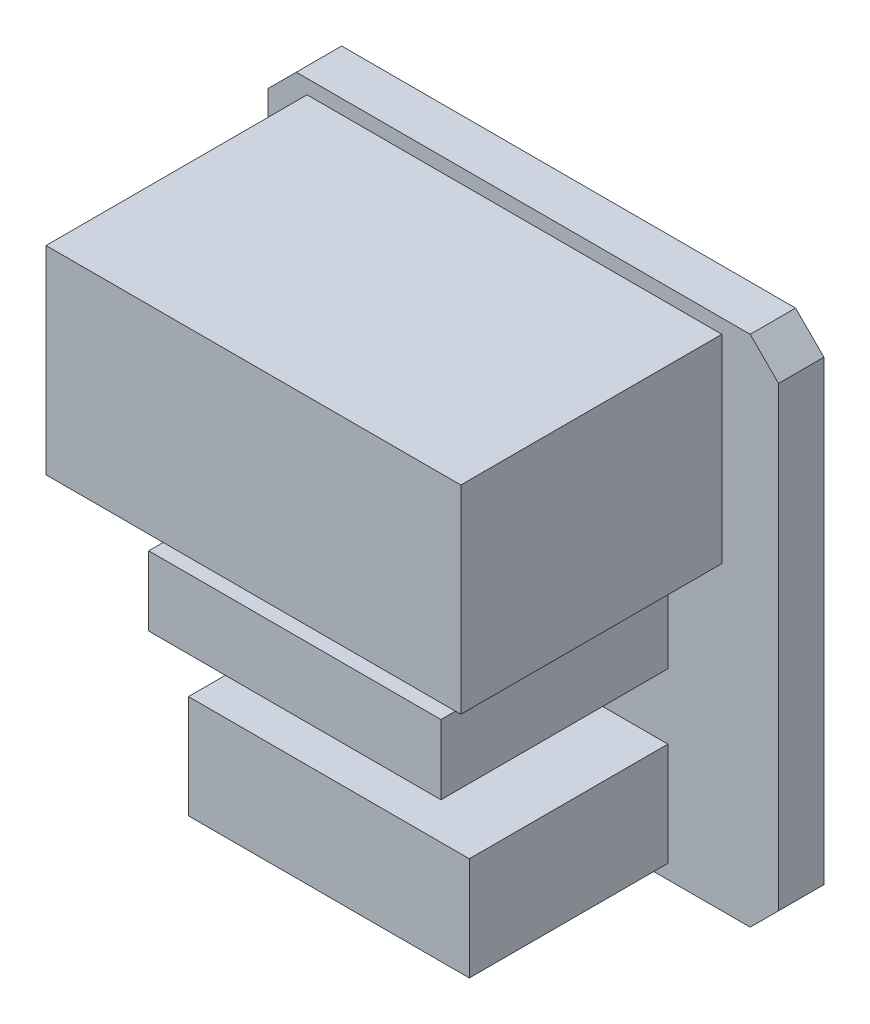
ISO-10303-21;
HEADER;
FILE_DESCRIPTION(('STEP AP214'),'2;1');
FILE_NAME('part.step','',(''),(''),'','','');
FILE_SCHEMA(('AUTOMOTIVE_DESIGN { 1 0 10303 214 1 1 1 1 }'));
ENDSEC;
DATA;
#1=APPLICATION_CONTEXT('core data for automotive mechanical design processes');
#2=APPLICATION_PROTOCOL_DEFINITION('international standard','automotive_design',2000,#1);
#3=PRODUCT_CONTEXT('',#1,'mechanical');
#4=PRODUCT('Part','Part','',(#3));
#5=PRODUCT_RELATED_PRODUCT_CATEGORY('part','',(#4));
#6=PRODUCT_DEFINITION_FORMATION('','',#4);
#7=PRODUCT_DEFINITION_CONTEXT('part definition',#1,'design');
#8=PRODUCT_DEFINITION('design','',#6,#7);
#9=PRODUCT_DEFINITION_SHAPE('','',#8);
#10=(LENGTH_UNIT() NAMED_UNIT(*) SI_UNIT(.MILLI.,.METRE.));
#11=(NAMED_UNIT(*) PLANE_ANGLE_UNIT() SI_UNIT($,.RADIAN.));
#12=(NAMED_UNIT(*) SI_UNIT($,.STERADIAN.) SOLID_ANGLE_UNIT());
#13=UNCERTAINTY_MEASURE_WITH_UNIT(LENGTH_MEASURE(1.E-05),#10,'distance_accuracy_value','');
#14=(GEOMETRIC_REPRESENTATION_CONTEXT(3) GLOBAL_UNCERTAINTY_ASSIGNED_CONTEXT((#13)) GLOBAL_UNIT_ASSIGNED_CONTEXT((#10,
#11,#12)) REPRESENTATION_CONTEXT('',''));
#15=CARTESIAN_POINT('',(0.,0.,0.));
#16=DIRECTION('',(0.,0.,1.));
#17=DIRECTION('',(1.,0.,0.));
#18=AXIS2_PLACEMENT_3D('',#15,#16,#17);
#19=CARTESIAN_POINT('',(0.,18.1,1.6));
#20=DIRECTION('',(0.,0.,-1.));
#21=DIRECTION('',(-1.,0.,0.));
#22=AXIS2_PLACEMENT_3D('',#19,#20,#21);
#23=PLANE('',#22);
#24=DIRECTION('',(0.,-1.,0.));
#25=VECTOR('',#24,1.);
#26=CARTESIAN_POINT('',(3.8,8.89,1.6));
#27=LINE('',#26,#25);
#28=CARTESIAN_POINT('',(3.8,8.89,1.6));
#29=VERTEX_POINT('',#28);
#30=CARTESIAN_POINT('',(3.8,6.44,1.6));
#31=VERTEX_POINT('',#30);
#32=EDGE_CURVE('E191',#29,#31,#27,.T.);
#33=ORIENTED_EDGE('',*,*,#32,.F.);
#34=DIRECTION('',(-1.,0.,0.));
#35=VECTOR('',#34,1.);
#36=CARTESIAN_POINT('',(3.8,8.89,1.6));
#37=LINE('',#36,#35);
#38=CARTESIAN_POINT('',(14.1,8.89,1.6));
#39=VERTEX_POINT('',#38);
#40=EDGE_CURVE('E204',#39,#29,#37,.T.);
#41=ORIENTED_EDGE('',*,*,#40,.F.);
#42=DIRECTION('',(0.,1.,0.));
#43=VECTOR('',#42,1.);
#44=CARTESIAN_POINT('',(14.1,8.89,1.6));
#45=LINE('',#44,#43);
#46=CARTESIAN_POINT('',(14.1,6.44,1.6));
#47=VERTEX_POINT('',#46);
#48=EDGE_CURVE('E213',#47,#39,#45,.T.);
#49=ORIENTED_EDGE('',*,*,#48,.F.);
#50=DIRECTION('',(1.,0.,0.));
#51=VECTOR('',#50,1.);
#52=CARTESIAN_POINT('',(3.8,6.44,1.6));
#53=LINE('',#52,#51);
#54=EDGE_CURVE('E194',#31,#47,#53,.T.);
#55=ORIENTED_EDGE('',*,*,#54,.F.);
#56=EDGE_LOOP('',(#33,#41,#49,#55));
#57=FACE_BOUND('',#56,.T.);
#58=DIRECTION('',(0.,-1.,0.));
#59=VECTOR('',#58,1.);
#60=CARTESIAN_POINT('',(0.,0.,1.6));
#61=LINE('',#60,#59);
#62=CARTESIAN_POINT('',(0.,17.1,1.6));
#63=VERTEX_POINT('',#62);
#64=CARTESIAN_POINT('',(0.,1.,1.6));
#65=VERTEX_POINT('',#64);
#66=EDGE_CURVE('E263',#63,#65,#61,.T.);
#67=ORIENTED_EDGE('',*,*,#66,.T.);
#68=DIRECTION('',(-0.707106781186546,0.707106781186549,0.));
#69=VECTOR('',#68,1.);
#70=CARTESIAN_POINT('',(1.,0.,1.6));
#71=LINE('',#70,#69);
#72=CARTESIAN_POINT('',(1.,0.,1.6));
#73=VERTEX_POINT('',#72);
#74=EDGE_CURVE('E310',#65,#73,#71,.F.);
#75=ORIENTED_EDGE('',*,*,#74,.T.);
#76=DIRECTION('',(1.,0.,0.));
#77=VECTOR('',#76,1.);
#78=CARTESIAN_POINT('',(0.,0.,1.6));
#79=LINE('',#78,#77);
#80=CARTESIAN_POINT('',(17.,0.,1.6));
#81=VERTEX_POINT('',#80);
#82=EDGE_CURVE('E266',#73,#81,#79,.T.);
#83=ORIENTED_EDGE('',*,*,#82,.T.);
#84=DIRECTION('',(-0.707106781186549,-0.707106781186546,0.));
#85=VECTOR('',#84,1.);
#86=CARTESIAN_POINT('',(18.,1.,1.6));
#87=LINE('',#86,#85);
#88=CARTESIAN_POINT('',(18.,1.,1.6));
#89=VERTEX_POINT('',#88);
#90=EDGE_CURVE('E308',#81,#89,#87,.F.);
#91=ORIENTED_EDGE('',*,*,#90,.T.);
#92=DIRECTION('',(0.,1.,0.));
#93=VECTOR('',#92,1.);
#94=CARTESIAN_POINT('',(18.,0.,1.6));
#95=LINE('',#94,#93);
#96=CARTESIAN_POINT('',(18.,17.1,1.6));
#97=VERTEX_POINT('',#96);
#98=EDGE_CURVE('E270',#89,#97,#95,.T.);
#99=ORIENTED_EDGE('',*,*,#98,.T.);
#100=DIRECTION('',(0.707106781186546,-0.707106781186549,0.));
#101=VECTOR('',#100,1.);
#102=CARTESIAN_POINT('',(17.,18.1,1.6));
#103=LINE('',#102,#101);
#104=CARTESIAN_POINT('',(17.,18.1,1.6));
#105=VERTEX_POINT('',#104);
#106=EDGE_CURVE('E306',#97,#105,#103,.F.);
#107=ORIENTED_EDGE('',*,*,#106,.T.);
#108=DIRECTION('',(-1.,0.,0.));
#109=VECTOR('',#108,1.);
#110=CARTESIAN_POINT('',(0.,18.1,1.6));
#111=LINE('',#110,#109);
#112=CARTESIAN_POINT('',(1.,18.1,1.6));
#113=VERTEX_POINT('',#112);
#114=EDGE_CURVE('E273',#105,#113,#111,.T.);
#115=ORIENTED_EDGE('',*,*,#114,.T.);
#116=DIRECTION('',(0.707106781186549,0.707106781186547,0.));
#117=VECTOR('',#116,1.);
#118=CARTESIAN_POINT('',(0.,17.1,1.6));
#119=LINE('',#118,#117);
#120=EDGE_CURVE('E304',#113,#63,#119,.F.);
#121=ORIENTED_EDGE('',*,*,#120,.T.);
#122=EDGE_LOOP('',(#67,#75,#83,#91,#99,#107,#115,#121));
#123=FACE_BOUND('',#122,.T.);
#124=DIRECTION('',(0.,-1.,0.));
#125=VECTOR('',#124,1.);
#126=CARTESIAN_POINT('',(4.2,4.14,1.6));
#127=LINE('',#126,#125);
#128=CARTESIAN_POINT('',(4.2,4.14,1.6));
#129=VERTEX_POINT('',#128);
#130=CARTESIAN_POINT('',(4.2,0.5,1.6));
#131=VERTEX_POINT('',#130);
#132=EDGE_CURVE('E229',#129,#131,#127,.T.);
#133=ORIENTED_EDGE('',*,*,#132,.F.);
#134=DIRECTION('',(-1.,0.,0.));
#135=VECTOR('',#134,1.);
#136=CARTESIAN_POINT('',(4.2,4.14,1.6));
#137=LINE('',#136,#135);
#138=CARTESIAN_POINT('',(14.1,4.14,1.6));
#139=VERTEX_POINT('',#138);
#140=EDGE_CURVE('E234',#139,#129,#137,.T.);
#141=ORIENTED_EDGE('',*,*,#140,.F.);
#142=DIRECTION('',(0.,1.,0.));
#143=VECTOR('',#142,1.);
#144=CARTESIAN_POINT('',(14.1,4.14,1.6));
#145=LINE('',#144,#143);
#146=CARTESIAN_POINT('',(14.1,0.5,1.6));
#147=VERTEX_POINT('',#146);
#148=EDGE_CURVE('E246',#147,#139,#145,.T.);
#149=ORIENTED_EDGE('',*,*,#148,.F.);
#150=DIRECTION('',(1.,0.,0.));
#151=VECTOR('',#150,1.);
#152=CARTESIAN_POINT('',(4.2,0.5,1.6));
#153=LINE('',#152,#151);
#154=EDGE_CURVE('E243',#131,#147,#153,.T.);
#155=ORIENTED_EDGE('',*,*,#154,.F.);
#156=EDGE_LOOP('',(#133,#141,#149,#155));
#157=FACE_BOUND('',#156,.T.);
#158=DIRECTION('',(0.,-1.,0.));
#159=VECTOR('',#158,1.);
#160=CARTESIAN_POINT('',(1.38,17.6,1.6));
#161=LINE('',#160,#159);
#162=CARTESIAN_POINT('',(1.38,17.6,1.6));
#163=VERTEX_POINT('',#162);
#164=CARTESIAN_POINT('',(1.38,10.6,1.6));
#165=VERTEX_POINT('',#164);
#166=EDGE_CURVE('E190',#163,#165,#161,.T.);
#167=ORIENTED_EDGE('',*,*,#166,.F.);
#168=DIRECTION('',(-1.,0.,0.));
#169=VECTOR('',#168,1.);
#170=CARTESIAN_POINT('',(1.38,17.6,1.6));
#171=LINE('',#170,#169);
#172=CARTESIAN_POINT('',(16.,17.6,1.6));
#173=VERTEX_POINT('',#172);
#174=EDGE_CURVE('E187',#173,#163,#171,.T.);
#175=ORIENTED_EDGE('',*,*,#174,.F.);
#176=DIRECTION('',(0.,1.,0.));
#177=VECTOR('',#176,1.);
#178=CARTESIAN_POINT('',(16.,17.6,1.6));
#179=LINE('',#178,#177);
#180=CARTESIAN_POINT('',(16.,10.6,1.6));
#181=VERTEX_POINT('',#180);
#182=EDGE_CURVE('E53',#181,#173,#179,.T.);
#183=ORIENTED_EDGE('',*,*,#182,.F.);
#184=DIRECTION('',(1.,0.,0.));
#185=VECTOR('',#184,1.);
#186=CARTESIAN_POINT('',(1.38,10.6,1.6));
#187=LINE('',#186,#185);
#188=EDGE_CURVE('E48',#165,#181,#187,.T.);
#189=ORIENTED_EDGE('',*,*,#188,.F.);
#190=EDGE_LOOP('',(#167,#175,#183,#189));
#191=FACE_BOUND('',#190,.T.);
#192=ADVANCED_FACE('F33',(#57,#123,#157,#191),#23,.F.);
#193=CARTESIAN_POINT('',(0.,0.,1.6));
#194=DIRECTION('',(1.,0.,0.));
#195=DIRECTION('',(0.,0.,-1.));
#196=AXIS2_PLACEMENT_3D('',#193,#194,#195);
#197=PLANE('',#196);
#198=DIRECTION('',(0.,-1.,0.));
#199=VECTOR('',#198,1.);
#200=CARTESIAN_POINT('',(0.,0.,0.));
#201=LINE('',#200,#199);
#202=CARTESIAN_POINT('',(0.,17.1,0.));
#203=VERTEX_POINT('',#202);
#204=CARTESIAN_POINT('',(0.,1.,0.));
#205=VERTEX_POINT('',#204);
#206=EDGE_CURVE('E262',#203,#205,#201,.T.);
#207=ORIENTED_EDGE('',*,*,#206,.T.);
#208=DIRECTION('',(0.,0.,1.));
#209=VECTOR('',#208,1.);
#210=CARTESIAN_POINT('',(0.,1.,1.6));
#211=LINE('',#210,#209);
#212=EDGE_CURVE('E302',#205,#65,#211,.T.);
#213=ORIENTED_EDGE('',*,*,#212,.T.);
#214=ORIENTED_EDGE('',*,*,#66,.F.);
#215=DIRECTION('',(0.,0.,-1.));
#216=VECTOR('',#215,1.);
#217=CARTESIAN_POINT('',(0.,17.1,1.6));
#218=LINE('',#217,#216);
#219=EDGE_CURVE('E299',#63,#203,#218,.T.);
#220=ORIENTED_EDGE('',*,*,#219,.T.);
#221=EDGE_LOOP('',(#207,#213,#214,#220));
#222=FACE_BOUND('',#221,.T.);
#223=ADVANCED_FACE('F331',(#222),#197,.F.);
#224=CARTESIAN_POINT('',(0.,0.,1.6));
#225=DIRECTION('',(0.,1.,0.));
#226=DIRECTION('',(0.,0.,1.));
#227=AXIS2_PLACEMENT_3D('',#224,#225,#226);
#228=PLANE('',#227);
#229=ORIENTED_EDGE('',*,*,#82,.F.);
#230=DIRECTION('',(0.,0.,-1.));
#231=VECTOR('',#230,1.);
#232=CARTESIAN_POINT('',(1.,0.,1.6));
#233=LINE('',#232,#231);
#234=CARTESIAN_POINT('',(1.,0.,0.));
#235=VERTEX_POINT('',#234);
#236=EDGE_CURVE('E288',#73,#235,#233,.T.);
#237=ORIENTED_EDGE('',*,*,#236,.T.);
#238=DIRECTION('',(1.,0.,0.));
#239=VECTOR('',#238,1.);
#240=CARTESIAN_POINT('',(0.,0.,0.));
#241=LINE('',#240,#239);
#242=CARTESIAN_POINT('',(17.,0.,0.));
#243=VERTEX_POINT('',#242);
#244=EDGE_CURVE('E279',#235,#243,#241,.T.);
#245=ORIENTED_EDGE('',*,*,#244,.T.);
#246=DIRECTION('',(0.,0.,1.));
#247=VECTOR('',#246,1.);
#248=CARTESIAN_POINT('',(17.,0.,1.6));
#249=LINE('',#248,#247);
#250=EDGE_CURVE('E276',#243,#81,#249,.T.);
#251=ORIENTED_EDGE('',*,*,#250,.T.);
#252=EDGE_LOOP('',(#229,#237,#245,#251));
#253=FACE_BOUND('',#252,.T.);
#254=ADVANCED_FACE('F342',(#253),#228,.F.);
#255=CARTESIAN_POINT('',(18.,0.,1.6));
#256=DIRECTION('',(-1.,0.,0.));
#257=DIRECTION('',(0.,0.,1.));
#258=AXIS2_PLACEMENT_3D('',#255,#256,#257);
#259=PLANE('',#258);
#260=ORIENTED_EDGE('',*,*,#98,.F.);
#261=DIRECTION('',(0.,0.,-1.));
#262=VECTOR('',#261,1.);
#263=CARTESIAN_POINT('',(18.,1.,1.6));
#264=LINE('',#263,#262);
#265=CARTESIAN_POINT('',(18.,0.999999999999999,0.));
#266=VERTEX_POINT('',#265);
#267=EDGE_CURVE('E314',#89,#266,#264,.T.);
#268=ORIENTED_EDGE('',*,*,#267,.T.);
#269=DIRECTION('',(0.,1.,0.));
#270=VECTOR('',#269,1.);
#271=CARTESIAN_POINT('',(18.,0.,0.));
#272=LINE('',#271,#270);
#273=CARTESIAN_POINT('',(18.,17.1,0.));
#274=VERTEX_POINT('',#273);
#275=EDGE_CURVE('E282',#266,#274,#272,.T.);
#276=ORIENTED_EDGE('',*,*,#275,.T.);
#277=DIRECTION('',(0.,0.,1.));
#278=VECTOR('',#277,1.);
#279=CARTESIAN_POINT('',(18.,17.1,1.6));
#280=LINE('',#279,#278);
#281=EDGE_CURVE('E312',#274,#97,#280,.T.);
#282=ORIENTED_EDGE('',*,*,#281,.T.);
#283=EDGE_LOOP('',(#260,#268,#276,#282));
#284=FACE_BOUND('',#283,.T.);
#285=ADVANCED_FACE('F351',(#284),#259,.F.);
#286=CARTESIAN_POINT('',(0.,18.1,1.6));
#287=DIRECTION('',(0.,-1.,0.));
#288=DIRECTION('',(0.,0.,-1.));
#289=AXIS2_PLACEMENT_3D('',#286,#287,#288);
#290=PLANE('',#289);
#291=ORIENTED_EDGE('',*,*,#114,.F.);
#292=DIRECTION('',(0.,0.,-1.));
#293=VECTOR('',#292,1.);
#294=CARTESIAN_POINT('',(17.,18.1,1.6));
#295=LINE('',#294,#293);
#296=CARTESIAN_POINT('',(17.,18.1,0.));
#297=VERTEX_POINT('',#296);
#298=EDGE_CURVE('E11',#105,#297,#295,.T.);
#299=ORIENTED_EDGE('',*,*,#298,.T.);
#300=DIRECTION('',(-1.,0.,0.));
#301=VECTOR('',#300,1.);
#302=CARTESIAN_POINT('',(0.,18.1,0.));
#303=LINE('',#302,#301);
#304=CARTESIAN_POINT('',(1.,18.1,0.));
#305=VERTEX_POINT('',#304);
#306=EDGE_CURVE('E267',#297,#305,#303,.T.);
#307=ORIENTED_EDGE('',*,*,#306,.T.);
#308=DIRECTION('',(0.,0.,1.));
#309=VECTOR('',#308,1.);
#310=CARTESIAN_POINT('',(1.,18.1,1.6));
#311=LINE('',#310,#309);
#312=EDGE_CURVE('E41',#305,#113,#311,.T.);
#313=ORIENTED_EDGE('',*,*,#312,.T.);
#314=EDGE_LOOP('',(#291,#299,#307,#313));
#315=FACE_BOUND('',#314,.T.);
#316=ADVANCED_FACE('F319',(#315),#290,.F.);
#317=CARTESIAN_POINT('',(0.,18.1,0.));
#318=DIRECTION('',(0.,0.,-1.));
#319=DIRECTION('',(-1.,0.,0.));
#320=AXIS2_PLACEMENT_3D('',#317,#318,#319);
#321=PLANE('',#320);
#322=ORIENTED_EDGE('',*,*,#244,.F.);
#323=DIRECTION('',(0.707106781186546,-0.707106781186549,0.));
#324=VECTOR('',#323,1.);
#325=CARTESIAN_POINT('',(-8.55,9.55000000000004,0.));
#326=LINE('',#325,#324);
#327=EDGE_CURVE('E297',#235,#205,#326,.F.);
#328=ORIENTED_EDGE('',*,*,#327,.T.);
#329=ORIENTED_EDGE('',*,*,#206,.F.);
#330=DIRECTION('',(-0.707106781186549,-0.707106781186547,0.));
#331=VECTOR('',#330,1.);
#332=CARTESIAN_POINT('',(0.499999999999999,17.6,0.));
#333=LINE('',#332,#331);
#334=EDGE_CURVE('E291',#203,#305,#333,.F.);
#335=ORIENTED_EDGE('',*,*,#334,.T.);
#336=ORIENTED_EDGE('',*,*,#306,.F.);
#337=DIRECTION('',(-0.707106781186546,0.707106781186549,0.));
#338=VECTOR('',#337,1.);
#339=CARTESIAN_POINT('',(8.50000000000003,26.6,0.));
#340=LINE('',#339,#338);
#341=EDGE_CURVE('E293',#297,#274,#340,.F.);
#342=ORIENTED_EDGE('',*,*,#341,.T.);
#343=ORIENTED_EDGE('',*,*,#275,.F.);
#344=DIRECTION('',(0.707106781186549,0.707106781186546,0.));
#345=VECTOR('',#344,1.);
#346=CARTESIAN_POINT('',(17.55,0.549999999999971,0.));
#347=LINE('',#346,#345);
#348=EDGE_CURVE('E295',#266,#243,#347,.F.);
#349=ORIENTED_EDGE('',*,*,#348,.T.);
#350=EDGE_LOOP('',(#322,#328,#329,#335,#336,#342,#343,#349));
#351=FACE_BOUND('',#350,.T.);
#352=ADVANCED_FACE('F335',(#351),#321,.T.);
#353=CARTESIAN_POINT('',(1.,0.,1.6));
#354=DIRECTION('',(0.707106781186549,0.707106781186546,0.));
#355=DIRECTION('',(-0.707106781186546,0.707106781186549,0.));
#356=AXIS2_PLACEMENT_3D('',#353,#354,#355);
#357=PLANE('',#356);
#358=ORIENTED_EDGE('',*,*,#74,.F.);
#359=ORIENTED_EDGE('',*,*,#212,.F.);
#360=ORIENTED_EDGE('',*,*,#327,.F.);
#361=ORIENTED_EDGE('',*,*,#236,.F.);
#362=EDGE_LOOP('',(#358,#359,#360,#361));
#363=FACE_BOUND('',#362,.T.);
#364=ADVANCED_FACE('F339',(#363),#357,.F.);
#365=CARTESIAN_POINT('',(18.,1.,1.6));
#366=DIRECTION('',(-0.707106781186546,0.707106781186549,0.));
#367=DIRECTION('',(-0.707106781186549,-0.707106781186546,0.));
#368=AXIS2_PLACEMENT_3D('',#365,#366,#367);
#369=PLANE('',#368);
#370=ORIENTED_EDGE('',*,*,#90,.F.);
#371=ORIENTED_EDGE('',*,*,#250,.F.);
#372=ORIENTED_EDGE('',*,*,#348,.F.);
#373=ORIENTED_EDGE('',*,*,#267,.F.);
#374=EDGE_LOOP('',(#370,#371,#372,#373));
#375=FACE_BOUND('',#374,.T.);
#376=ADVANCED_FACE('F348',(#375),#369,.F.);
#377=CARTESIAN_POINT('',(17.,18.1,1.6));
#378=DIRECTION('',(-0.707106781186549,-0.707106781186546,0.));
#379=DIRECTION('',(0.707106781186546,-0.707106781186549,0.));
#380=AXIS2_PLACEMENT_3D('',#377,#378,#379);
#381=PLANE('',#380);
#382=ORIENTED_EDGE('',*,*,#106,.F.);
#383=ORIENTED_EDGE('',*,*,#281,.F.);
#384=ORIENTED_EDGE('',*,*,#341,.F.);
#385=ORIENTED_EDGE('',*,*,#298,.F.);
#386=EDGE_LOOP('',(#382,#383,#384,#385));
#387=FACE_BOUND('',#386,.T.);
#388=ADVANCED_FACE('F354',(#387),#381,.F.);
#389=CARTESIAN_POINT('',(0.,17.1,1.6));
#390=DIRECTION('',(0.707106781186547,-0.707106781186549,0.));
#391=DIRECTION('',(0.707106781186549,0.707106781186547,0.));
#392=AXIS2_PLACEMENT_3D('',#389,#390,#391);
#393=PLANE('',#392);
#394=ORIENTED_EDGE('',*,*,#120,.F.);
#395=ORIENTED_EDGE('',*,*,#312,.F.);
#396=ORIENTED_EDGE('',*,*,#334,.F.);
#397=ORIENTED_EDGE('',*,*,#219,.F.);
#398=EDGE_LOOP('',(#394,#395,#396,#397));
#399=FACE_BOUND('',#398,.T.);
#400=ADVANCED_FACE('F35',(#399),#393,.F.);
#401=CARTESIAN_POINT('',(4.2,4.14,8.6));
#402=DIRECTION('',(1.,0.,0.));
#403=DIRECTION('',(0.,0.,-1.));
#404=AXIS2_PLACEMENT_3D('',#401,#402,#403);
#405=PLANE('',#404);
#406=ORIENTED_EDGE('',*,*,#132,.T.);
#407=DIRECTION('',(0.,0.,-1.));
#408=VECTOR('',#407,1.);
#409=CARTESIAN_POINT('',(4.2,0.5,8.6));
#410=LINE('',#409,#408);
#411=CARTESIAN_POINT('',(4.2,0.5,8.6));
#412=VERTEX_POINT('',#411);
#413=EDGE_CURVE('E259',#412,#131,#410,.T.);
#414=ORIENTED_EDGE('',*,*,#413,.F.);
#415=DIRECTION('',(0.,-1.,0.));
#416=VECTOR('',#415,1.);
#417=CARTESIAN_POINT('',(4.2,4.14,8.6));
#418=LINE('',#417,#416);
#419=CARTESIAN_POINT('',(4.2,4.14,8.6));
#420=VERTEX_POINT('',#419);
#421=EDGE_CURVE('E230',#420,#412,#418,.T.);
#422=ORIENTED_EDGE('',*,*,#421,.F.);
#423=DIRECTION('',(0.,0.,-1.));
#424=VECTOR('',#423,1.);
#425=CARTESIAN_POINT('',(4.2,4.14,8.6));
#426=LINE('',#425,#424);
#427=EDGE_CURVE('E240',#420,#129,#426,.T.);
#428=ORIENTED_EDGE('',*,*,#427,.T.);
#429=EDGE_LOOP('',(#406,#414,#422,#428));
#430=FACE_BOUND('',#429,.T.);
#431=ADVANCED_FACE('F360',(#430),#405,.F.);
#432=CARTESIAN_POINT('',(4.2,0.5,8.6));
#433=DIRECTION('',(0.,1.,0.));
#434=DIRECTION('',(0.,0.,1.));
#435=AXIS2_PLACEMENT_3D('',#432,#433,#434);
#436=PLANE('',#435);
#437=ORIENTED_EDGE('',*,*,#154,.T.);
#438=DIRECTION('',(0.,0.,-1.));
#439=VECTOR('',#438,1.);
#440=CARTESIAN_POINT('',(14.1,0.5,8.6));
#441=LINE('',#440,#439);
#442=CARTESIAN_POINT('',(14.1,0.5,8.6));
#443=VERTEX_POINT('',#442);
#444=EDGE_CURVE('E256',#443,#147,#441,.T.);
#445=ORIENTED_EDGE('',*,*,#444,.F.);
#446=DIRECTION('',(1.,0.,0.));
#447=VECTOR('',#446,1.);
#448=CARTESIAN_POINT('',(4.2,0.5,8.6));
#449=LINE('',#448,#447);
#450=EDGE_CURVE('E233',#412,#443,#449,.T.);
#451=ORIENTED_EDGE('',*,*,#450,.F.);
#452=ORIENTED_EDGE('',*,*,#413,.T.);
#453=EDGE_LOOP('',(#437,#445,#451,#452));
#454=FACE_BOUND('',#453,.T.);
#455=ADVANCED_FACE('F408',(#454),#436,.F.);
#456=CARTESIAN_POINT('',(14.1,4.14,8.6));
#457=DIRECTION('',(-1.,0.,0.));
#458=DIRECTION('',(0.,-1.,0.));
#459=AXIS2_PLACEMENT_3D('',#456,#457,#458);
#460=PLANE('',#459);
#461=ORIENTED_EDGE('',*,*,#148,.T.);
#462=DIRECTION('',(0.,0.,-1.));
#463=VECTOR('',#462,1.);
#464=CARTESIAN_POINT('',(14.1,4.14,8.6));
#465=LINE('',#464,#463);
#466=CARTESIAN_POINT('',(14.1,4.14,8.6));
#467=VERTEX_POINT('',#466);
#468=EDGE_CURVE('E253',#467,#139,#465,.T.);
#469=ORIENTED_EDGE('',*,*,#468,.F.);
#470=DIRECTION('',(0.,1.,0.));
#471=VECTOR('',#470,1.);
#472=CARTESIAN_POINT('',(14.1,4.14,8.6));
#473=LINE('',#472,#471);
#474=EDGE_CURVE('E236',#443,#467,#473,.T.);
#475=ORIENTED_EDGE('',*,*,#474,.F.);
#476=ORIENTED_EDGE('',*,*,#444,.T.);
#477=EDGE_LOOP('',(#461,#469,#475,#476));
#478=FACE_BOUND('',#477,.T.);
#479=ADVANCED_FACE('F417',(#478),#460,.F.);
#480=CARTESIAN_POINT('',(4.2,4.14,8.6));
#481=DIRECTION('',(0.,-1.,0.));
#482=DIRECTION('',(0.,0.,-1.));
#483=AXIS2_PLACEMENT_3D('',#480,#481,#482);
#484=PLANE('',#483);
#485=ORIENTED_EDGE('',*,*,#140,.T.);
#486=ORIENTED_EDGE('',*,*,#427,.F.);
#487=DIRECTION('',(-1.,0.,0.));
#488=VECTOR('',#487,1.);
#489=CARTESIAN_POINT('',(4.2,4.14,8.6));
#490=LINE('',#489,#488);
#491=EDGE_CURVE('E238',#467,#420,#490,.T.);
#492=ORIENTED_EDGE('',*,*,#491,.F.);
#493=ORIENTED_EDGE('',*,*,#468,.T.);
#494=EDGE_LOOP('',(#485,#486,#492,#493));
#495=FACE_BOUND('',#494,.T.);
#496=ADVANCED_FACE('F426',(#495),#484,.F.);
#497=CARTESIAN_POINT('',(4.2,0.5,8.6));
#498=DIRECTION('',(0.,0.,1.));
#499=DIRECTION('',(1.,0.,0.));
#500=AXIS2_PLACEMENT_3D('',#497,#498,#499);
#501=PLANE('',#500);
#502=ORIENTED_EDGE('',*,*,#421,.T.);
#503=ORIENTED_EDGE('',*,*,#450,.T.);
#504=ORIENTED_EDGE('',*,*,#474,.T.);
#505=ORIENTED_EDGE('',*,*,#491,.T.);
#506=EDGE_LOOP('',(#502,#503,#504,#505));
#507=FACE_BOUND('',#506,.T.);
#508=ADVANCED_FACE('F436',(#507),#501,.T.);
#509=CARTESIAN_POINT('',(3.8,8.89,9.6));
#510=DIRECTION('',(1.,0.,0.));
#511=DIRECTION('',(0.,1.,0.));
#512=AXIS2_PLACEMENT_3D('',#509,#510,#511);
#513=PLANE('',#512);
#514=ORIENTED_EDGE('',*,*,#32,.T.);
#515=DIRECTION('',(0.,0.,-1.));
#516=VECTOR('',#515,1.);
#517=CARTESIAN_POINT('',(3.8,6.44,9.6));
#518=LINE('',#517,#516);
#519=CARTESIAN_POINT('',(3.8,6.44,9.6));
#520=VERTEX_POINT('',#519);
#521=EDGE_CURVE('E226',#520,#31,#518,.T.);
#522=ORIENTED_EDGE('',*,*,#521,.F.);
#523=DIRECTION('',(0.,-1.,0.));
#524=VECTOR('',#523,1.);
#525=CARTESIAN_POINT('',(3.8,8.89,9.6));
#526=LINE('',#525,#524);
#527=CARTESIAN_POINT('',(3.8,8.89,9.6));
#528=VERTEX_POINT('',#527);
#529=EDGE_CURVE('E200',#528,#520,#526,.T.);
#530=ORIENTED_EDGE('',*,*,#529,.F.);
#531=DIRECTION('',(0.,0.,-1.));
#532=VECTOR('',#531,1.);
#533=CARTESIAN_POINT('',(3.8,8.89,9.6));
#534=LINE('',#533,#532);
#535=EDGE_CURVE('E209',#528,#29,#534,.T.);
#536=ORIENTED_EDGE('',*,*,#535,.T.);
#537=EDGE_LOOP('',(#514,#522,#530,#536));
#538=FACE_BOUND('',#537,.T.);
#539=ADVANCED_FACE('F446',(#538),#513,.F.);
#540=CARTESIAN_POINT('',(3.8,6.44,9.6));
#541=DIRECTION('',(0.,1.,0.));
#542=DIRECTION('',(0.,0.,1.));
#543=AXIS2_PLACEMENT_3D('',#540,#541,#542);
#544=PLANE('',#543);
#545=ORIENTED_EDGE('',*,*,#54,.T.);
#546=DIRECTION('',(0.,0.,-1.));
#547=VECTOR('',#546,1.);
#548=CARTESIAN_POINT('',(14.1,6.44,9.6));
#549=LINE('',#548,#547);
#550=CARTESIAN_POINT('',(14.1,6.44,9.6));
#551=VERTEX_POINT('',#550);
#552=EDGE_CURVE('E223',#551,#47,#549,.T.);
#553=ORIENTED_EDGE('',*,*,#552,.F.);
#554=DIRECTION('',(1.,0.,0.));
#555=VECTOR('',#554,1.);
#556=CARTESIAN_POINT('',(3.8,6.44,9.6));
#557=LINE('',#556,#555);
#558=EDGE_CURVE('E203',#520,#551,#557,.T.);
#559=ORIENTED_EDGE('',*,*,#558,.F.);
#560=ORIENTED_EDGE('',*,*,#521,.T.);
#561=EDGE_LOOP('',(#545,#553,#559,#560));
#562=FACE_BOUND('',#561,.T.);
#563=ADVANCED_FACE('F456',(#562),#544,.F.);
#564=CARTESIAN_POINT('',(14.1,8.89,9.6));
#565=DIRECTION('',(-1.,0.,0.));
#566=DIRECTION('',(0.,0.,1.));
#567=AXIS2_PLACEMENT_3D('',#564,#565,#566);
#568=PLANE('',#567);
#569=ORIENTED_EDGE('',*,*,#48,.T.);
#570=DIRECTION('',(0.,0.,-1.));
#571=VECTOR('',#570,1.);
#572=CARTESIAN_POINT('',(14.1,8.89,9.6));
#573=LINE('',#572,#571);
#574=CARTESIAN_POINT('',(14.1,8.89,9.6));
#575=VERTEX_POINT('',#574);
#576=EDGE_CURVE('E220',#575,#39,#573,.T.);
#577=ORIENTED_EDGE('',*,*,#576,.F.);
#578=DIRECTION('',(0.,1.,0.));
#579=VECTOR('',#578,1.);
#580=CARTESIAN_POINT('',(14.1,8.89,9.6));
#581=LINE('',#580,#579);
#582=EDGE_CURVE('E206',#551,#575,#581,.T.);
#583=ORIENTED_EDGE('',*,*,#582,.F.);
#584=ORIENTED_EDGE('',*,*,#552,.T.);
#585=EDGE_LOOP('',(#569,#577,#583,#584));
#586=FACE_BOUND('',#585,.T.);
#587=ADVANCED_FACE('F466',(#586),#568,.F.);
#588=CARTESIAN_POINT('',(3.8,8.89,9.6));
#589=DIRECTION('',(0.,-1.,0.));
#590=DIRECTION('',(0.,0.,-1.));
#591=AXIS2_PLACEMENT_3D('',#588,#589,#590);
#592=PLANE('',#591);
#593=ORIENTED_EDGE('',*,*,#40,.T.);
#594=ORIENTED_EDGE('',*,*,#535,.F.);
#595=DIRECTION('',(-1.,0.,0.));
#596=VECTOR('',#595,1.);
#597=CARTESIAN_POINT('',(3.8,8.89,9.6));
#598=LINE('',#597,#596);
#599=EDGE_CURVE('E208',#575,#528,#598,.T.);
#600=ORIENTED_EDGE('',*,*,#599,.F.);
#601=ORIENTED_EDGE('',*,*,#576,.T.);
#602=EDGE_LOOP('',(#593,#594,#600,#601));
#603=FACE_BOUND('',#602,.T.);
#604=ADVANCED_FACE('F476',(#603),#592,.F.);
#605=CARTESIAN_POINT('',(3.8,6.44,9.6));
#606=DIRECTION('',(0.,0.,1.));
#607=DIRECTION('',(1.,0.,0.));
#608=AXIS2_PLACEMENT_3D('',#605,#606,#607);
#609=PLANE('',#608);
#610=ORIENTED_EDGE('',*,*,#529,.T.);
#611=ORIENTED_EDGE('',*,*,#558,.T.);
#612=ORIENTED_EDGE('',*,*,#582,.T.);
#613=ORIENTED_EDGE('',*,*,#599,.T.);
#614=EDGE_LOOP('',(#610,#611,#612,#613));
#615=FACE_BOUND('',#614,.T.);
#616=ADVANCED_FACE('F486',(#615),#609,.T.);
#617=CARTESIAN_POINT('',(1.38,17.6,10.8));
#618=DIRECTION('',(1.,0.,0.));
#619=DIRECTION('',(0.,1.,0.));
#620=AXIS2_PLACEMENT_3D('',#617,#618,#619);
#621=PLANE('',#620);
#622=ORIENTED_EDGE('',*,*,#166,.T.);
#623=DIRECTION('',(0.,0.,-1.));
#624=VECTOR('',#623,1.);
#625=CARTESIAN_POINT('',(1.38,10.6,10.8));
#626=LINE('',#625,#624);
#627=CARTESIAN_POINT('',(1.38,10.6,10.8));
#628=VERTEX_POINT('',#627);
#629=EDGE_CURVE('E171',#628,#165,#626,.T.);
#630=ORIENTED_EDGE('',*,*,#629,.F.);
#631=DIRECTION('',(0.,-1.,0.));
#632=VECTOR('',#631,1.);
#633=CARTESIAN_POINT('',(1.38,17.6,10.8));
#634=LINE('',#633,#632);
#635=CARTESIAN_POINT('',(1.38,17.6,10.8));
#636=VERTEX_POINT('',#635);
#637=EDGE_CURVE('E178',#636,#628,#634,.T.);
#638=ORIENTED_EDGE('',*,*,#637,.F.);
#639=DIRECTION('',(0.,0.,-1.));
#640=VECTOR('',#639,1.);
#641=CARTESIAN_POINT('',(1.38,17.6,10.8));
#642=LINE('',#641,#640);
#643=EDGE_CURVE('E550',#636,#163,#642,.T.);
#644=ORIENTED_EDGE('',*,*,#643,.T.);
#645=EDGE_LOOP('',(#622,#630,#638,#644));
#646=FACE_BOUND('',#645,.T.);
#647=ADVANCED_FACE('F189',(#646),#621,.F.);
#648=CARTESIAN_POINT('',(1.38,10.6,10.8));
#649=DIRECTION('',(0.,1.,0.));
#650=DIRECTION('',(0.,0.,1.));
#651=AXIS2_PLACEMENT_3D('',#648,#649,#650);
#652=PLANE('',#651);
#653=ORIENTED_EDGE('',*,*,#188,.T.);
#654=DIRECTION('',(0.,0.,-1.));
#655=VECTOR('',#654,1.);
#656=CARTESIAN_POINT('',(16.,10.6,10.8));
#657=LINE('',#656,#655);
#658=CARTESIAN_POINT('',(16.,10.6,10.8));
#659=VERTEX_POINT('',#658);
#660=EDGE_CURVE('E174',#659,#181,#657,.T.);
#661=ORIENTED_EDGE('',*,*,#660,.F.);
#662=DIRECTION('',(1.,0.,0.));
#663=VECTOR('',#662,1.);
#664=CARTESIAN_POINT('',(1.38,10.6,10.8));
#665=LINE('',#664,#663);
#666=EDGE_CURVE('E167',#628,#659,#665,.T.);
#667=ORIENTED_EDGE('',*,*,#666,.F.);
#668=ORIENTED_EDGE('',*,*,#629,.T.);
#669=EDGE_LOOP('',(#653,#661,#667,#668));
#670=FACE_BOUND('',#669,.T.);
#671=ADVANCED_FACE('F169',(#670),#652,.F.);
#672=CARTESIAN_POINT('',(16.,17.6,10.8));
#673=DIRECTION('',(-1.,0.,0.));
#674=DIRECTION('',(0.,0.,1.));
#675=AXIS2_PLACEMENT_3D('',#672,#673,#674);
#676=PLANE('',#675);
#677=ORIENTED_EDGE('',*,*,#182,.T.);
#678=DIRECTION('',(0.,0.,-1.));
#679=VECTOR('',#678,1.);
#680=CARTESIAN_POINT('',(16.,17.6,10.8));
#681=LINE('',#680,#679);
#682=CARTESIAN_POINT('',(16.,17.6,10.8));
#683=VERTEX_POINT('',#682);
#684=EDGE_CURVE('E196',#683,#173,#681,.T.);
#685=ORIENTED_EDGE('',*,*,#684,.F.);
#686=DIRECTION('',(0.,1.,0.));
#687=VECTOR('',#686,1.);
#688=CARTESIAN_POINT('',(16.,17.6,10.8));
#689=LINE('',#688,#687);
#690=EDGE_CURVE('E177',#659,#683,#689,.T.);
#691=ORIENTED_EDGE('',*,*,#690,.F.);
#692=ORIENTED_EDGE('',*,*,#660,.T.);
#693=EDGE_LOOP('',(#677,#685,#691,#692));
#694=FACE_BOUND('',#693,.T.);
#695=ADVANCED_FACE('F517',(#694),#676,.F.);
#696=CARTESIAN_POINT('',(1.38,17.6,10.8));
#697=DIRECTION('',(0.,-1.,0.));
#698=DIRECTION('',(0.,0.,-1.));
#699=AXIS2_PLACEMENT_3D('',#696,#697,#698);
#700=PLANE('',#699);
#701=ORIENTED_EDGE('',*,*,#174,.T.);
#702=ORIENTED_EDGE('',*,*,#643,.F.);
#703=DIRECTION('',(-1.,0.,0.));
#704=VECTOR('',#703,1.);
#705=CARTESIAN_POINT('',(1.38,17.6,10.8));
#706=LINE('',#705,#704);
#707=EDGE_CURVE('E183',#683,#636,#706,.T.);
#708=ORIENTED_EDGE('',*,*,#707,.F.);
#709=ORIENTED_EDGE('',*,*,#684,.T.);
#710=EDGE_LOOP('',(#701,#702,#708,#709));
#711=FACE_BOUND('',#710,.T.);
#712=ADVANCED_FACE('F526',(#711),#700,.F.);
#713=CARTESIAN_POINT('',(1.38,10.6,10.8));
#714=DIRECTION('',(0.,0.,1.));
#715=DIRECTION('',(1.,0.,0.));
#716=AXIS2_PLACEMENT_3D('',#713,#714,#715);
#717=PLANE('',#716);
#718=ORIENTED_EDGE('',*,*,#637,.T.);
#719=ORIENTED_EDGE('',*,*,#666,.T.);
#720=ORIENTED_EDGE('',*,*,#690,.T.);
#721=ORIENTED_EDGE('',*,*,#707,.T.);
#722=EDGE_LOOP('',(#718,#719,#720,#721));
#723=FACE_BOUND('',#722,.T.);
#724=ADVANCED_FACE('F181',(#723),#717,.T.);
#725=CLOSED_SHELL('',(#192,#223,#254,#285,#316,#352,#364,#376,#388,#400,#431,#455,#479,#496,
#508,#539,#563,#587,#604,#616,#647,#671,#695,#712,#724));
#726=MANIFOLD_SOLID_BREP('B2',#725);
#727=ADVANCED_BREP_SHAPE_REPRESENTATION('',(#18,#726),#14);
#728=SHAPE_DEFINITION_REPRESENTATION(#9,#727);
ENDSEC;
END-ISO-10303-21;
